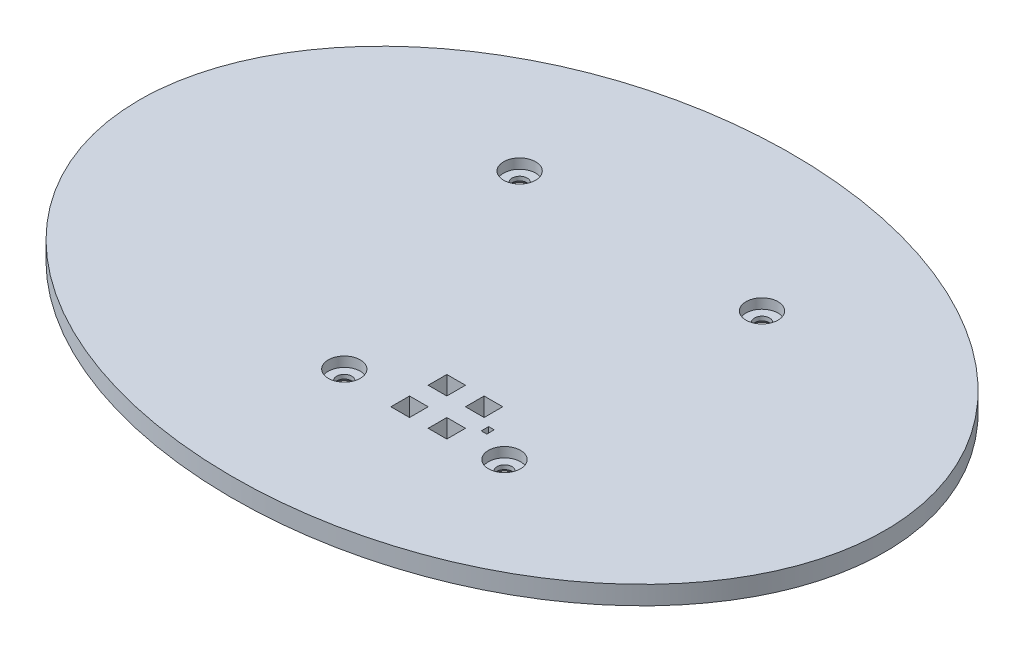
ISO-10303-21;
HEADER;
FILE_DESCRIPTION(('STEP AP214'),'2;1');
FILE_NAME('part.step','',(''),(''),'','','');
FILE_SCHEMA(('AUTOMOTIVE_DESIGN { 1 0 10303 214 1 1 1 1 }'));
ENDSEC;
DATA;
#1=APPLICATION_CONTEXT('core data for automotive mechanical design processes');
#2=APPLICATION_PROTOCOL_DEFINITION('international standard','automotive_design',2000,#1);
#3=PRODUCT_CONTEXT('',#1,'mechanical');
#4=PRODUCT('Part','Part','',(#3));
#5=PRODUCT_RELATED_PRODUCT_CATEGORY('part','',(#4));
#6=PRODUCT_DEFINITION_FORMATION('','',#4);
#7=PRODUCT_DEFINITION_CONTEXT('part definition',#1,'design');
#8=PRODUCT_DEFINITION('design','',#6,#7);
#9=PRODUCT_DEFINITION_SHAPE('','',#8);
#10=(LENGTH_UNIT() NAMED_UNIT(*) SI_UNIT(.MILLI.,.METRE.));
#11=(NAMED_UNIT(*) PLANE_ANGLE_UNIT() SI_UNIT($,.RADIAN.));
#12=(NAMED_UNIT(*) SI_UNIT($,.STERADIAN.) SOLID_ANGLE_UNIT());
#13=UNCERTAINTY_MEASURE_WITH_UNIT(LENGTH_MEASURE(1.E-05),#10,'distance_accuracy_value','');
#14=(GEOMETRIC_REPRESENTATION_CONTEXT(3) GLOBAL_UNCERTAINTY_ASSIGNED_CONTEXT((#13)) GLOBAL_UNIT_ASSIGNED_CONTEXT((#10,
#11,#12)) REPRESENTATION_CONTEXT('',''));
#15=CARTESIAN_POINT('',(0.,0.,0.));
#16=DIRECTION('',(0.,0.,1.));
#17=DIRECTION('',(1.,0.,0.));
#18=AXIS2_PLACEMENT_3D('',#15,#16,#17);
#19=CARTESIAN_POINT('',(0.,2.54,0.));
#20=DIRECTION('',(0.,1.,0.));
#21=DIRECTION('',(-1.,0.,0.));
#22=AXIS2_PLACEMENT_3D('',#19,#20,#21);
#23=ELLIPSE('',#22,50.8,38.1);
#24=DIRECTION('',(0.,-1.,0.));
#25=VECTOR('',#24,1.);
#26=SURFACE_OF_LINEAR_EXTRUSION('',#23,#25);
#27=CARTESIAN_POINT('',(-50.8,2.54,0.));
#28=VERTEX_POINT('',#27);
#29=EDGE_CURVE('E11',#28,#28,#23,.T.);
#30=ORIENTED_EDGE('',*,*,#29,.F.);
#31=EDGE_LOOP('',(#30));
#32=FACE_BOUND('',#31,.T.);
#33=CARTESIAN_POINT('',(0.,0.,0.));
#34=DIRECTION('',(0.,1.,0.));
#35=DIRECTION('',(-1.,0.,0.));
#36=AXIS2_PLACEMENT_3D('',#33,#34,#35);
#37=ELLIPSE('',#36,50.8,38.1);
#38=CARTESIAN_POINT('',(-50.8,0.,0.));
#39=VERTEX_POINT('',#38);
#40=EDGE_CURVE('E39',#39,#39,#37,.T.);
#41=ORIENTED_EDGE('',*,*,#40,.T.);
#42=EDGE_LOOP('',(#41));
#43=FACE_BOUND('',#42,.T.);
#44=ADVANCED_FACE('F35',(#32,#43),#26,.F.);
#45=CARTESIAN_POINT('',(0.,2.54,0.));
#46=DIRECTION('',(0.,1.,0.));
#47=DIRECTION('',(0.,0.,1.));
#48=AXIS2_PLACEMENT_3D('',#45,#46,#47);
#49=PLANE('',#48);
#50=CARTESIAN_POINT('',(-5.08000000000001,2.54,17.78));
#51=DIRECTION('',(0.,1.,0.));
#52=DIRECTION('',(0.,0.,1.));
#53=AXIS2_PLACEMENT_3D('',#50,#51,#52);
#54=CIRCLE('',#53,2.18313);
#55=CARTESIAN_POINT('',(-5.08000000000001,2.54,19.96313));
#56=VERTEX_POINT('',#55);
#57=EDGE_CURVE('E521',#56,#56,#54,.T.);
#58=ORIENTED_EDGE('',*,*,#57,.F.);
#59=EDGE_LOOP('',(#58));
#60=FACE_BOUND('',#59,.T.);
#61=CARTESIAN_POINT('',(16.51,2.54,17.541875));
#62=DIRECTION('',(0.,1.,0.));
#63=DIRECTION('',(0.,0.,1.));
#64=AXIS2_PLACEMENT_3D('',#61,#62,#63);
#65=CIRCLE('',#64,2.18313);
#66=CARTESIAN_POINT('',(16.51,2.54,19.725005));
#67=VERTEX_POINT('',#66);
#68=EDGE_CURVE('E536',#67,#67,#65,.T.);
#69=ORIENTED_EDGE('',*,*,#68,.F.);
#70=EDGE_LOOP('',(#69));
#71=FACE_BOUND('',#70,.T.);
#72=CARTESIAN_POINT('',(16.51,2.54,-17.541875));
#73=DIRECTION('',(0.,1.,0.));
#74=DIRECTION('',(0.,0.,1.));
#75=AXIS2_PLACEMENT_3D('',#72,#73,#74);
#76=CIRCLE('',#75,2.18313);
#77=CARTESIAN_POINT('',(16.51,2.54,-15.358745));
#78=VERTEX_POINT('',#77);
#79=EDGE_CURVE('E551',#78,#78,#76,.T.);
#80=ORIENTED_EDGE('',*,*,#79,.F.);
#81=EDGE_LOOP('',(#80));
#82=FACE_BOUND('',#81,.T.);
#83=CARTESIAN_POINT('',(-16.51,2.54,-17.541875));
#84=DIRECTION('',(0.,1.,0.));
#85=DIRECTION('',(0.,0.,1.));
#86=AXIS2_PLACEMENT_3D('',#83,#84,#85);
#87=CIRCLE('',#86,2.18313);
#88=CARTESIAN_POINT('',(-16.51,2.54,-15.358745));
#89=VERTEX_POINT('',#88);
#90=EDGE_CURVE('E566',#89,#89,#87,.T.);
#91=ORIENTED_EDGE('',*,*,#90,.F.);
#92=EDGE_LOOP('',(#91));
#93=FACE_BOUND('',#92,.T.);
#94=DIRECTION('',(0.,0.,1.));
#95=VECTOR('',#94,1.);
#96=CARTESIAN_POINT('',(11.5379302112366,2.54,14.732));
#97=LINE('',#96,#95);
#98=CARTESIAN_POINT('',(11.5379302112366,2.54,14.732));
#99=VERTEX_POINT('',#98);
#100=CARTESIAN_POINT('',(11.5379302112366,2.54,15.748));
#101=VERTEX_POINT('',#100);
#102=EDGE_CURVE('E49',#99,#101,#97,.T.);
#103=ORIENTED_EDGE('',*,*,#102,.F.);
#104=DIRECTION('',(-1.,0.,0.));
#105=VECTOR('',#104,1.);
#106=CARTESIAN_POINT('',(11.5379302112366,2.54,14.732));
#107=LINE('',#106,#105);
#108=CARTESIAN_POINT('',(12.2999302112366,2.54,14.732));
#109=VERTEX_POINT('',#108);
#110=EDGE_CURVE('E189',#109,#99,#107,.T.);
#111=ORIENTED_EDGE('',*,*,#110,.F.);
#112=DIRECTION('',(0.,0.,-1.));
#113=VECTOR('',#112,1.);
#114=CARTESIAN_POINT('',(12.2999302112366,2.54,14.732));
#115=LINE('',#114,#113);
#116=CARTESIAN_POINT('',(12.2999302112366,2.54,15.748));
#117=VERTEX_POINT('',#116);
#118=EDGE_CURVE('E192',#117,#109,#115,.T.);
#119=ORIENTED_EDGE('',*,*,#118,.F.);
#120=DIRECTION('',(1.,0.,0.));
#121=VECTOR('',#120,1.);
#122=CARTESIAN_POINT('',(11.5379302112366,2.54,15.748));
#123=LINE('',#122,#121);
#124=EDGE_CURVE('E201',#101,#117,#123,.T.);
#125=ORIENTED_EDGE('',*,*,#124,.F.);
#126=EDGE_LOOP('',(#103,#111,#119,#125));
#127=FACE_BOUND('',#126,.T.);
#128=DIRECTION('',(0.,0.,-1.));
#129=VECTOR('',#128,1.);
#130=CARTESIAN_POINT('',(5.08,2.54,13.97));
#131=LINE('',#130,#129);
#132=CARTESIAN_POINT('',(5.08,2.54,13.97));
#133=VERTEX_POINT('',#132);
#134=CARTESIAN_POINT('',(5.08,2.54,11.43));
#135=VERTEX_POINT('',#134);
#136=EDGE_CURVE('E207',#133,#135,#131,.T.);
#137=ORIENTED_EDGE('',*,*,#136,.F.);
#138=DIRECTION('',(1.,0.,0.));
#139=VECTOR('',#138,1.);
#140=CARTESIAN_POINT('',(5.08,2.54,13.97));
#141=LINE('',#140,#139);
#142=CARTESIAN_POINT('',(2.54,2.54,13.97));
#143=VERTEX_POINT('',#142);
#144=EDGE_CURVE('E215',#143,#133,#141,.T.);
#145=ORIENTED_EDGE('',*,*,#144,.F.);
#146=DIRECTION('',(0.,0.,1.));
#147=VECTOR('',#146,1.);
#148=CARTESIAN_POINT('',(2.54,2.54,13.97));
#149=LINE('',#148,#147);
#150=CARTESIAN_POINT('',(2.54,2.54,11.43));
#151=VERTEX_POINT('',#150);
#152=EDGE_CURVE('E229',#151,#143,#149,.T.);
#153=ORIENTED_EDGE('',*,*,#152,.F.);
#154=DIRECTION('',(-1.,0.,0.));
#155=VECTOR('',#154,1.);
#156=CARTESIAN_POINT('',(5.08,2.54,11.43));
#157=LINE('',#156,#155);
#158=EDGE_CURVE('E226',#135,#151,#157,.T.);
#159=ORIENTED_EDGE('',*,*,#158,.F.);
#160=EDGE_LOOP('',(#137,#145,#153,#159));
#161=FACE_BOUND('',#160,.T.);
#162=DIRECTION('',(0.,0.,-1.));
#163=VECTOR('',#162,1.);
#164=CARTESIAN_POINT('',(5.08,2.54,16.51));
#165=LINE('',#164,#163);
#166=CARTESIAN_POINT('',(5.08,2.54,19.05));
#167=VERTEX_POINT('',#166);
#168=CARTESIAN_POINT('',(5.08,2.54,16.51));
#169=VERTEX_POINT('',#168);
#170=EDGE_CURVE('E236',#167,#169,#165,.T.);
#171=ORIENTED_EDGE('',*,*,#170,.F.);
#172=DIRECTION('',(1.,0.,0.));
#173=VECTOR('',#172,1.);
#174=CARTESIAN_POINT('',(5.08,2.54,19.05));
#175=LINE('',#174,#173);
#176=CARTESIAN_POINT('',(2.54,2.54,19.05));
#177=VERTEX_POINT('',#176);
#178=EDGE_CURVE('E247',#177,#167,#175,.T.);
#179=ORIENTED_EDGE('',*,*,#178,.F.);
#180=DIRECTION('',(0.,0.,1.));
#181=VECTOR('',#180,1.);
#182=CARTESIAN_POINT('',(2.54,2.54,16.51));
#183=LINE('',#182,#181);
#184=CARTESIAN_POINT('',(2.54,2.54,16.51));
#185=VERTEX_POINT('',#184);
#186=EDGE_CURVE('E261',#185,#177,#183,.T.);
#187=ORIENTED_EDGE('',*,*,#186,.F.);
#188=DIRECTION('',(-1.,0.,0.));
#189=VECTOR('',#188,1.);
#190=CARTESIAN_POINT('',(5.08,2.54,16.51));
#191=LINE('',#190,#189);
#192=EDGE_CURVE('E258',#169,#185,#191,.T.);
#193=ORIENTED_EDGE('',*,*,#192,.F.);
#194=EDGE_LOOP('',(#171,#179,#187,#193));
#195=FACE_BOUND('',#194,.T.);
#196=DIRECTION('',(0.,0.,-1.));
#197=VECTOR('',#196,1.);
#198=CARTESIAN_POINT('',(10.16,2.54,13.97));
#199=LINE('',#198,#197);
#200=CARTESIAN_POINT('',(10.16,2.54,13.97));
#201=VERTEX_POINT('',#200);
#202=CARTESIAN_POINT('',(10.16,2.54,11.43));
#203=VERTEX_POINT('',#202);
#204=EDGE_CURVE('E268',#201,#203,#199,.T.);
#205=ORIENTED_EDGE('',*,*,#204,.F.);
#206=DIRECTION('',(1.,0.,0.));
#207=VECTOR('',#206,1.);
#208=CARTESIAN_POINT('',(10.16,2.54,13.97));
#209=LINE('',#208,#207);
#210=CARTESIAN_POINT('',(7.62,2.54,13.97));
#211=VERTEX_POINT('',#210);
#212=EDGE_CURVE('E279',#211,#201,#209,.T.);
#213=ORIENTED_EDGE('',*,*,#212,.F.);
#214=DIRECTION('',(0.,0.,1.));
#215=VECTOR('',#214,1.);
#216=CARTESIAN_POINT('',(7.62,2.54,13.97));
#217=LINE('',#216,#215);
#218=CARTESIAN_POINT('',(7.62,2.54,11.43));
#219=VERTEX_POINT('',#218);
#220=EDGE_CURVE('E293',#219,#211,#217,.T.);
#221=ORIENTED_EDGE('',*,*,#220,.F.);
#222=DIRECTION('',(-1.,0.,0.));
#223=VECTOR('',#222,1.);
#224=CARTESIAN_POINT('',(10.16,2.54,11.43));
#225=LINE('',#224,#223);
#226=EDGE_CURVE('E290',#203,#219,#225,.T.);
#227=ORIENTED_EDGE('',*,*,#226,.F.);
#228=EDGE_LOOP('',(#205,#213,#221,#227));
#229=FACE_BOUND('',#228,.T.);
#230=DIRECTION('',(0.,0.,-1.));
#231=VECTOR('',#230,1.);
#232=CARTESIAN_POINT('',(10.16,2.54,19.05));
#233=LINE('',#232,#231);
#234=CARTESIAN_POINT('',(10.16,2.54,19.05));
#235=VERTEX_POINT('',#234);
#236=CARTESIAN_POINT('',(10.16,2.54,16.51));
#237=VERTEX_POINT('',#236);
#238=EDGE_CURVE('E300',#235,#237,#233,.T.);
#239=ORIENTED_EDGE('',*,*,#238,.F.);
#240=DIRECTION('',(1.,0.,0.));
#241=VECTOR('',#240,1.);
#242=CARTESIAN_POINT('',(10.16,2.54,19.05));
#243=LINE('',#242,#241);
#244=CARTESIAN_POINT('',(7.62,2.54,19.05));
#245=VERTEX_POINT('',#244);
#246=EDGE_CURVE('E311',#245,#235,#243,.T.);
#247=ORIENTED_EDGE('',*,*,#246,.F.);
#248=DIRECTION('',(0.,0.,1.));
#249=VECTOR('',#248,1.);
#250=CARTESIAN_POINT('',(7.62,2.54,19.05));
#251=LINE('',#250,#249);
#252=CARTESIAN_POINT('',(7.62,2.54,16.51));
#253=VERTEX_POINT('',#252);
#254=EDGE_CURVE('E325',#253,#245,#251,.T.);
#255=ORIENTED_EDGE('',*,*,#254,.F.);
#256=DIRECTION('',(-1.,0.,0.));
#257=VECTOR('',#256,1.);
#258=CARTESIAN_POINT('',(10.16,2.54,16.51));
#259=LINE('',#258,#257);
#260=EDGE_CURVE('E322',#237,#253,#259,.T.);
#261=ORIENTED_EDGE('',*,*,#260,.F.);
#262=EDGE_LOOP('',(#239,#247,#255,#261));
#263=FACE_BOUND('',#262,.T.);
#264=ORIENTED_EDGE('',*,*,#29,.T.);
#265=EDGE_LOOP('',(#264));
#266=FACE_BOUND('',#265,.T.);
#267=ADVANCED_FACE('F348',(#60,#71,#82,#93,#127,#161,#195,#229,#263,#266),#49,.T.);
#268=CARTESIAN_POINT('',(0.,0.,0.));
#269=DIRECTION('',(0.,1.,0.));
#270=DIRECTION('',(0.,0.,1.));
#271=AXIS2_PLACEMENT_3D('',#268,#269,#270);
#272=PLANE('',#271);
#273=CARTESIAN_POINT('',(-5.08000000000001,0.,17.78));
#274=DIRECTION('',(0.,1.,0.));
#275=DIRECTION('',(0.,0.,1.));
#276=AXIS2_PLACEMENT_3D('',#273,#274,#275);
#277=CIRCLE('',#276,1.6637);
#278=CARTESIAN_POINT('',(-5.08000000000001,0.,19.4437));
#279=VERTEX_POINT('',#278);
#280=EDGE_CURVE('E522',#279,#279,#277,.T.);
#281=ORIENTED_EDGE('',*,*,#280,.T.);
#282=EDGE_LOOP('',(#281));
#283=FACE_BOUND('',#282,.T.);
#284=CARTESIAN_POINT('',(16.51,0.,17.541875));
#285=DIRECTION('',(0.,1.,0.));
#286=DIRECTION('',(0.,0.,1.));
#287=AXIS2_PLACEMENT_3D('',#284,#285,#286);
#288=CIRCLE('',#287,1.6637);
#289=CARTESIAN_POINT('',(16.51,0.,19.205575));
#290=VERTEX_POINT('',#289);
#291=EDGE_CURVE('E533',#290,#290,#288,.T.);
#292=ORIENTED_EDGE('',*,*,#291,.T.);
#293=EDGE_LOOP('',(#292));
#294=FACE_BOUND('',#293,.T.);
#295=CARTESIAN_POINT('',(16.51,0.,-17.541875));
#296=DIRECTION('',(0.,1.,0.));
#297=DIRECTION('',(0.,0.,1.));
#298=AXIS2_PLACEMENT_3D('',#295,#296,#297);
#299=CIRCLE('',#298,1.6637);
#300=CARTESIAN_POINT('',(16.51,0.,-15.878175));
#301=VERTEX_POINT('',#300);
#302=EDGE_CURVE('E548',#301,#301,#299,.T.);
#303=ORIENTED_EDGE('',*,*,#302,.T.);
#304=EDGE_LOOP('',(#303));
#305=FACE_BOUND('',#304,.T.);
#306=CARTESIAN_POINT('',(-16.51,0.,-17.541875));
#307=DIRECTION('',(0.,1.,0.));
#308=DIRECTION('',(0.,0.,1.));
#309=AXIS2_PLACEMENT_3D('',#306,#307,#308);
#310=CIRCLE('',#309,1.6637);
#311=CARTESIAN_POINT('',(-16.51,0.,-15.878175));
#312=VERTEX_POINT('',#311);
#313=EDGE_CURVE('E563',#312,#312,#310,.T.);
#314=ORIENTED_EDGE('',*,*,#313,.T.);
#315=EDGE_LOOP('',(#314));
#316=FACE_BOUND('',#315,.T.);
#317=DIRECTION('',(-1.,0.,0.));
#318=VECTOR('',#317,1.);
#319=CARTESIAN_POINT('',(11.5379302112366,0.,14.732));
#320=LINE('',#319,#318);
#321=CARTESIAN_POINT('',(12.2999302112366,0.,14.732));
#322=VERTEX_POINT('',#321);
#323=CARTESIAN_POINT('',(11.5379302112366,0.,14.732));
#324=VERTEX_POINT('',#323);
#325=EDGE_CURVE('E179',#322,#324,#320,.T.);
#326=ORIENTED_EDGE('',*,*,#325,.T.);
#327=DIRECTION('',(0.,0.,1.));
#328=VECTOR('',#327,1.);
#329=CARTESIAN_POINT('',(11.5379302112366,0.,14.732));
#330=LINE('',#329,#328);
#331=CARTESIAN_POINT('',(11.5379302112366,0.,15.748));
#332=VERTEX_POINT('',#331);
#333=EDGE_CURVE('E173',#324,#332,#330,.T.);
#334=ORIENTED_EDGE('',*,*,#333,.T.);
#335=DIRECTION('',(1.,0.,0.));
#336=VECTOR('',#335,1.);
#337=CARTESIAN_POINT('',(11.5379302112366,0.,15.748));
#338=LINE('',#337,#336);
#339=CARTESIAN_POINT('',(12.2999302112366,0.,15.748));
#340=VERTEX_POINT('',#339);
#341=EDGE_CURVE('E182',#332,#340,#338,.T.);
#342=ORIENTED_EDGE('',*,*,#341,.T.);
#343=DIRECTION('',(0.,0.,-1.));
#344=VECTOR('',#343,1.);
#345=CARTESIAN_POINT('',(12.2999302112366,0.,14.732));
#346=LINE('',#345,#344);
#347=EDGE_CURVE('E57',#340,#322,#346,.T.);
#348=ORIENTED_EDGE('',*,*,#347,.T.);
#349=EDGE_LOOP('',(#326,#334,#342,#348));
#350=FACE_BOUND('',#349,.T.);
#351=DIRECTION('',(1.,0.,0.));
#352=VECTOR('',#351,1.);
#353=CARTESIAN_POINT('',(5.08,0.,13.97));
#354=LINE('',#353,#352);
#355=CARTESIAN_POINT('',(2.54,0.,13.97));
#356=VERTEX_POINT('',#355);
#357=CARTESIAN_POINT('',(5.08,0.,13.97));
#358=VERTEX_POINT('',#357);
#359=EDGE_CURVE('E221',#356,#358,#354,.T.);
#360=ORIENTED_EDGE('',*,*,#359,.T.);
#361=DIRECTION('',(0.,0.,-1.));
#362=VECTOR('',#361,1.);
#363=CARTESIAN_POINT('',(5.08,0.,13.97));
#364=LINE('',#363,#362);
#365=CARTESIAN_POINT('',(5.08,0.,11.43));
#366=VERTEX_POINT('',#365);
#367=EDGE_CURVE('E211',#358,#366,#364,.T.);
#368=ORIENTED_EDGE('',*,*,#367,.T.);
#369=DIRECTION('',(-1.,0.,0.));
#370=VECTOR('',#369,1.);
#371=CARTESIAN_POINT('',(5.08,0.,11.43));
#372=LINE('',#371,#370);
#373=CARTESIAN_POINT('',(2.54,0.,11.43));
#374=VERTEX_POINT('',#373);
#375=EDGE_CURVE('E214',#366,#374,#372,.T.);
#376=ORIENTED_EDGE('',*,*,#375,.T.);
#377=DIRECTION('',(0.,0.,1.));
#378=VECTOR('',#377,1.);
#379=CARTESIAN_POINT('',(2.54,0.,13.97));
#380=LINE('',#379,#378);
#381=EDGE_CURVE('E218',#374,#356,#380,.T.);
#382=ORIENTED_EDGE('',*,*,#381,.T.);
#383=EDGE_LOOP('',(#360,#368,#376,#382));
#384=FACE_BOUND('',#383,.T.);
#385=DIRECTION('',(1.,0.,0.));
#386=VECTOR('',#385,1.);
#387=CARTESIAN_POINT('',(5.08,0.,19.05));
#388=LINE('',#387,#386);
#389=CARTESIAN_POINT('',(2.54,0.,19.05));
#390=VERTEX_POINT('',#389);
#391=CARTESIAN_POINT('',(5.08,0.,19.05));
#392=VERTEX_POINT('',#391);
#393=EDGE_CURVE('E253',#390,#392,#388,.T.);
#394=ORIENTED_EDGE('',*,*,#393,.T.);
#395=DIRECTION('',(0.,0.,-1.));
#396=VECTOR('',#395,1.);
#397=CARTESIAN_POINT('',(5.08,0.,16.51));
#398=LINE('',#397,#396);
#399=CARTESIAN_POINT('',(5.08,0.,16.51));
#400=VERTEX_POINT('',#399);
#401=EDGE_CURVE('E243',#392,#400,#398,.T.);
#402=ORIENTED_EDGE('',*,*,#401,.T.);
#403=DIRECTION('',(-1.,0.,0.));
#404=VECTOR('',#403,1.);
#405=CARTESIAN_POINT('',(5.08,0.,16.51));
#406=LINE('',#405,#404);
#407=CARTESIAN_POINT('',(2.54,0.,16.51));
#408=VERTEX_POINT('',#407);
#409=EDGE_CURVE('E246',#400,#408,#406,.T.);
#410=ORIENTED_EDGE('',*,*,#409,.T.);
#411=DIRECTION('',(0.,0.,1.));
#412=VECTOR('',#411,1.);
#413=CARTESIAN_POINT('',(2.54,0.,16.51));
#414=LINE('',#413,#412);
#415=EDGE_CURVE('E250',#408,#390,#414,.T.);
#416=ORIENTED_EDGE('',*,*,#415,.T.);
#417=EDGE_LOOP('',(#394,#402,#410,#416));
#418=FACE_BOUND('',#417,.T.);
#419=DIRECTION('',(1.,0.,0.));
#420=VECTOR('',#419,1.);
#421=CARTESIAN_POINT('',(10.16,0.,13.97));
#422=LINE('',#421,#420);
#423=CARTESIAN_POINT('',(7.62,0.,13.97));
#424=VERTEX_POINT('',#423);
#425=CARTESIAN_POINT('',(10.16,0.,13.97));
#426=VERTEX_POINT('',#425);
#427=EDGE_CURVE('E285',#424,#426,#422,.T.);
#428=ORIENTED_EDGE('',*,*,#427,.T.);
#429=DIRECTION('',(0.,0.,-1.));
#430=VECTOR('',#429,1.);
#431=CARTESIAN_POINT('',(10.16,0.,13.97));
#432=LINE('',#431,#430);
#433=CARTESIAN_POINT('',(10.16,0.,11.43));
#434=VERTEX_POINT('',#433);
#435=EDGE_CURVE('E275',#426,#434,#432,.T.);
#436=ORIENTED_EDGE('',*,*,#435,.T.);
#437=DIRECTION('',(-1.,0.,0.));
#438=VECTOR('',#437,1.);
#439=CARTESIAN_POINT('',(10.16,0.,11.43));
#440=LINE('',#439,#438);
#441=CARTESIAN_POINT('',(7.62,0.,11.43));
#442=VERTEX_POINT('',#441);
#443=EDGE_CURVE('E278',#434,#442,#440,.T.);
#444=ORIENTED_EDGE('',*,*,#443,.T.);
#445=DIRECTION('',(0.,0.,1.));
#446=VECTOR('',#445,1.);
#447=CARTESIAN_POINT('',(7.62,0.,13.97));
#448=LINE('',#447,#446);
#449=EDGE_CURVE('E282',#442,#424,#448,.T.);
#450=ORIENTED_EDGE('',*,*,#449,.T.);
#451=EDGE_LOOP('',(#428,#436,#444,#450));
#452=FACE_BOUND('',#451,.T.);
#453=DIRECTION('',(1.,0.,0.));
#454=VECTOR('',#453,1.);
#455=CARTESIAN_POINT('',(10.16,0.,19.05));
#456=LINE('',#455,#454);
#457=CARTESIAN_POINT('',(7.62,0.,19.05));
#458=VERTEX_POINT('',#457);
#459=CARTESIAN_POINT('',(10.16,0.,19.05));
#460=VERTEX_POINT('',#459);
#461=EDGE_CURVE('E317',#458,#460,#456,.T.);
#462=ORIENTED_EDGE('',*,*,#461,.T.);
#463=DIRECTION('',(0.,0.,-1.));
#464=VECTOR('',#463,1.);
#465=CARTESIAN_POINT('',(10.16,0.,19.05));
#466=LINE('',#465,#464);
#467=CARTESIAN_POINT('',(10.16,0.,16.51));
#468=VERTEX_POINT('',#467);
#469=EDGE_CURVE('E307',#460,#468,#466,.T.);
#470=ORIENTED_EDGE('',*,*,#469,.T.);
#471=DIRECTION('',(-1.,0.,0.));
#472=VECTOR('',#471,1.);
#473=CARTESIAN_POINT('',(10.16,0.,16.51));
#474=LINE('',#473,#472);
#475=CARTESIAN_POINT('',(7.62,0.,16.51));
#476=VERTEX_POINT('',#475);
#477=EDGE_CURVE('E310',#468,#476,#474,.T.);
#478=ORIENTED_EDGE('',*,*,#477,.T.);
#479=DIRECTION('',(0.,0.,1.));
#480=VECTOR('',#479,1.);
#481=CARTESIAN_POINT('',(7.62,0.,19.05));
#482=LINE('',#481,#480);
#483=EDGE_CURVE('E314',#476,#458,#482,.T.);
#484=ORIENTED_EDGE('',*,*,#483,.T.);
#485=EDGE_LOOP('',(#462,#470,#478,#484));
#486=FACE_BOUND('',#485,.T.);
#487=ORIENTED_EDGE('',*,*,#40,.F.);
#488=EDGE_LOOP('',(#487));
#489=FACE_BOUND('',#488,.T.);
#490=ADVANCED_FACE('F186',(#283,#294,#305,#316,#350,#384,#418,#452,#486,#489),#272,.F.);
#491=CARTESIAN_POINT('',(10.16,0.,19.05));
#492=DIRECTION('',(1.,0.,0.));
#493=DIRECTION('',(0.,0.,-1.));
#494=AXIS2_PLACEMENT_3D('',#491,#492,#493);
#495=PLANE('',#494);
#496=ORIENTED_EDGE('',*,*,#238,.T.);
#497=DIRECTION('',(0.,1.,0.));
#498=VECTOR('',#497,1.);
#499=CARTESIAN_POINT('',(10.16,0.,16.51));
#500=LINE('',#499,#498);
#501=EDGE_CURVE('E320',#468,#237,#500,.T.);
#502=ORIENTED_EDGE('',*,*,#501,.F.);
#503=ORIENTED_EDGE('',*,*,#469,.F.);
#504=DIRECTION('',(0.,1.,0.));
#505=VECTOR('',#504,1.);
#506=CARTESIAN_POINT('',(10.16,0.,19.05));
#507=LINE('',#506,#505);
#508=EDGE_CURVE('E330',#460,#235,#507,.T.);
#509=ORIENTED_EDGE('',*,*,#508,.T.);
#510=EDGE_LOOP('',(#496,#502,#503,#509));
#511=FACE_BOUND('',#510,.T.);
#512=ADVANCED_FACE('F356',(#511),#495,.F.);
#513=CARTESIAN_POINT('',(10.16,0.,19.05));
#514=DIRECTION('',(0.,0.,1.));
#515=DIRECTION('',(1.,0.,0.));
#516=AXIS2_PLACEMENT_3D('',#513,#514,#515);
#517=PLANE('',#516);
#518=ORIENTED_EDGE('',*,*,#246,.T.);
#519=ORIENTED_EDGE('',*,*,#508,.F.);
#520=ORIENTED_EDGE('',*,*,#461,.F.);
#521=DIRECTION('',(0.,1.,0.));
#522=VECTOR('',#521,1.);
#523=CARTESIAN_POINT('',(7.62,0.,19.05));
#524=LINE('',#523,#522);
#525=EDGE_CURVE('E332',#458,#245,#524,.T.);
#526=ORIENTED_EDGE('',*,*,#525,.T.);
#527=EDGE_LOOP('',(#518,#519,#520,#526));
#528=FACE_BOUND('',#527,.T.);
#529=ADVANCED_FACE('F358',(#528),#517,.F.);
#530=CARTESIAN_POINT('',(7.62,0.,19.05));
#531=DIRECTION('',(-1.,0.,0.));
#532=DIRECTION('',(0.,0.,1.));
#533=AXIS2_PLACEMENT_3D('',#530,#531,#532);
#534=PLANE('',#533);
#535=ORIENTED_EDGE('',*,*,#254,.T.);
#536=ORIENTED_EDGE('',*,*,#525,.F.);
#537=ORIENTED_EDGE('',*,*,#483,.F.);
#538=DIRECTION('',(0.,1.,0.));
#539=VECTOR('',#538,1.);
#540=CARTESIAN_POINT('',(7.62,0.,16.51));
#541=LINE('',#540,#539);
#542=EDGE_CURVE('E334',#476,#253,#541,.T.);
#543=ORIENTED_EDGE('',*,*,#542,.T.);
#544=EDGE_LOOP('',(#535,#536,#537,#543));
#545=FACE_BOUND('',#544,.T.);
#546=ADVANCED_FACE('F352',(#545),#534,.F.);
#547=CARTESIAN_POINT('',(10.16,0.,16.51));
#548=DIRECTION('',(0.,0.,-1.));
#549=DIRECTION('',(-1.,0.,0.));
#550=AXIS2_PLACEMENT_3D('',#547,#548,#549);
#551=PLANE('',#550);
#552=ORIENTED_EDGE('',*,*,#260,.T.);
#553=ORIENTED_EDGE('',*,*,#542,.F.);
#554=ORIENTED_EDGE('',*,*,#477,.F.);
#555=ORIENTED_EDGE('',*,*,#501,.T.);
#556=EDGE_LOOP('',(#552,#553,#554,#555));
#557=FACE_BOUND('',#556,.T.);
#558=ADVANCED_FACE('F341',(#557),#551,.F.);
#559=CARTESIAN_POINT('',(10.16,0.,13.97));
#560=DIRECTION('',(1.,0.,0.));
#561=DIRECTION('',(0.,0.,-1.));
#562=AXIS2_PLACEMENT_3D('',#559,#560,#561);
#563=PLANE('',#562);
#564=ORIENTED_EDGE('',*,*,#204,.T.);
#565=DIRECTION('',(0.,1.,0.));
#566=VECTOR('',#565,1.);
#567=CARTESIAN_POINT('',(10.16,0.,11.43));
#568=LINE('',#567,#566);
#569=EDGE_CURVE('E288',#434,#203,#568,.T.);
#570=ORIENTED_EDGE('',*,*,#569,.F.);
#571=ORIENTED_EDGE('',*,*,#435,.F.);
#572=DIRECTION('',(0.,1.,0.));
#573=VECTOR('',#572,1.);
#574=CARTESIAN_POINT('',(10.16,0.,13.97));
#575=LINE('',#574,#573);
#576=EDGE_CURVE('E298',#426,#201,#575,.T.);
#577=ORIENTED_EDGE('',*,*,#576,.T.);
#578=EDGE_LOOP('',(#564,#570,#571,#577));
#579=FACE_BOUND('',#578,.T.);
#580=ADVANCED_FACE('F387',(#579),#563,.F.);
#581=CARTESIAN_POINT('',(10.16,0.,13.97));
#582=DIRECTION('',(0.,0.,1.));
#583=DIRECTION('',(1.,0.,0.));
#584=AXIS2_PLACEMENT_3D('',#581,#582,#583);
#585=PLANE('',#584);
#586=ORIENTED_EDGE('',*,*,#212,.T.);
#587=ORIENTED_EDGE('',*,*,#576,.F.);
#588=ORIENTED_EDGE('',*,*,#427,.F.);
#589=DIRECTION('',(0.,1.,0.));
#590=VECTOR('',#589,1.);
#591=CARTESIAN_POINT('',(7.62,0.,13.97));
#592=LINE('',#591,#590);
#593=EDGE_CURVE('E301',#424,#211,#592,.T.);
#594=ORIENTED_EDGE('',*,*,#593,.T.);
#595=EDGE_LOOP('',(#586,#587,#588,#594));
#596=FACE_BOUND('',#595,.T.);
#597=ADVANCED_FACE('F391',(#596),#585,.F.);
#598=CARTESIAN_POINT('',(7.62,0.,13.97));
#599=DIRECTION('',(-1.,0.,0.));
#600=DIRECTION('',(0.,0.,1.));
#601=AXIS2_PLACEMENT_3D('',#598,#599,#600);
#602=PLANE('',#601);
#603=ORIENTED_EDGE('',*,*,#220,.T.);
#604=ORIENTED_EDGE('',*,*,#593,.F.);
#605=ORIENTED_EDGE('',*,*,#449,.F.);
#606=DIRECTION('',(0.,1.,0.));
#607=VECTOR('',#606,1.);
#608=CARTESIAN_POINT('',(7.62,0.,11.43));
#609=LINE('',#608,#607);
#610=EDGE_CURVE('E303',#442,#219,#609,.T.);
#611=ORIENTED_EDGE('',*,*,#610,.T.);
#612=EDGE_LOOP('',(#603,#604,#605,#611));
#613=FACE_BOUND('',#612,.T.);
#614=ADVANCED_FACE('F396',(#613),#602,.F.);
#615=CARTESIAN_POINT('',(10.16,0.,11.43));
#616=DIRECTION('',(0.,0.,-1.));
#617=DIRECTION('',(-1.,0.,0.));
#618=AXIS2_PLACEMENT_3D('',#615,#616,#617);
#619=PLANE('',#618);
#620=ORIENTED_EDGE('',*,*,#226,.T.);
#621=ORIENTED_EDGE('',*,*,#610,.F.);
#622=ORIENTED_EDGE('',*,*,#443,.F.);
#623=ORIENTED_EDGE('',*,*,#569,.T.);
#624=EDGE_LOOP('',(#620,#621,#622,#623));
#625=FACE_BOUND('',#624,.T.);
#626=ADVANCED_FACE('F400',(#625),#619,.F.);
#627=CARTESIAN_POINT('',(5.08,0.,16.51));
#628=DIRECTION('',(1.,0.,0.));
#629=DIRECTION('',(0.,0.,-1.));
#630=AXIS2_PLACEMENT_3D('',#627,#628,#629);
#631=PLANE('',#630);
#632=ORIENTED_EDGE('',*,*,#170,.T.);
#633=DIRECTION('',(0.,1.,0.));
#634=VECTOR('',#633,1.);
#635=CARTESIAN_POINT('',(5.08,0.,16.51));
#636=LINE('',#635,#634);
#637=EDGE_CURVE('E256',#400,#169,#636,.T.);
#638=ORIENTED_EDGE('',*,*,#637,.F.);
#639=ORIENTED_EDGE('',*,*,#401,.F.);
#640=DIRECTION('',(0.,1.,0.));
#641=VECTOR('',#640,1.);
#642=CARTESIAN_POINT('',(5.08,0.,19.05));
#643=LINE('',#642,#641);
#644=EDGE_CURVE('E266',#392,#167,#643,.T.);
#645=ORIENTED_EDGE('',*,*,#644,.T.);
#646=EDGE_LOOP('',(#632,#638,#639,#645));
#647=FACE_BOUND('',#646,.T.);
#648=ADVANCED_FACE('F403',(#647),#631,.F.);
#649=CARTESIAN_POINT('',(5.08,0.,19.05));
#650=DIRECTION('',(0.,0.,1.));
#651=DIRECTION('',(1.,0.,0.));
#652=AXIS2_PLACEMENT_3D('',#649,#650,#651);
#653=PLANE('',#652);
#654=ORIENTED_EDGE('',*,*,#178,.T.);
#655=ORIENTED_EDGE('',*,*,#644,.F.);
#656=ORIENTED_EDGE('',*,*,#393,.F.);
#657=DIRECTION('',(0.,1.,0.));
#658=VECTOR('',#657,1.);
#659=CARTESIAN_POINT('',(2.54,0.,19.05));
#660=LINE('',#659,#658);
#661=EDGE_CURVE('E269',#390,#177,#660,.T.);
#662=ORIENTED_EDGE('',*,*,#661,.T.);
#663=EDGE_LOOP('',(#654,#655,#656,#662));
#664=FACE_BOUND('',#663,.T.);
#665=ADVANCED_FACE('F410',(#664),#653,.F.);
#666=CARTESIAN_POINT('',(2.54,0.,16.51));
#667=DIRECTION('',(-1.,0.,0.));
#668=DIRECTION('',(0.,0.,1.));
#669=AXIS2_PLACEMENT_3D('',#666,#667,#668);
#670=PLANE('',#669);
#671=ORIENTED_EDGE('',*,*,#186,.T.);
#672=ORIENTED_EDGE('',*,*,#661,.F.);
#673=ORIENTED_EDGE('',*,*,#415,.F.);
#674=DIRECTION('',(0.,1.,0.));
#675=VECTOR('',#674,1.);
#676=CARTESIAN_POINT('',(2.54,0.,16.51));
#677=LINE('',#676,#675);
#678=EDGE_CURVE('E271',#408,#185,#677,.T.);
#679=ORIENTED_EDGE('',*,*,#678,.T.);
#680=EDGE_LOOP('',(#671,#672,#673,#679));
#681=FACE_BOUND('',#680,.T.);
#682=ADVANCED_FACE('F416',(#681),#670,.F.);
#683=CARTESIAN_POINT('',(5.08,0.,16.51));
#684=DIRECTION('',(0.,0.,-1.));
#685=DIRECTION('',(-1.,0.,0.));
#686=AXIS2_PLACEMENT_3D('',#683,#684,#685);
#687=PLANE('',#686);
#688=ORIENTED_EDGE('',*,*,#192,.T.);
#689=ORIENTED_EDGE('',*,*,#678,.F.);
#690=ORIENTED_EDGE('',*,*,#409,.F.);
#691=ORIENTED_EDGE('',*,*,#637,.T.);
#692=EDGE_LOOP('',(#688,#689,#690,#691));
#693=FACE_BOUND('',#692,.T.);
#694=ADVANCED_FACE('F412',(#693),#687,.F.);
#695=CARTESIAN_POINT('',(5.08,0.,13.97));
#696=DIRECTION('',(1.,0.,0.));
#697=DIRECTION('',(0.,0.,-1.));
#698=AXIS2_PLACEMENT_3D('',#695,#696,#697);
#699=PLANE('',#698);
#700=ORIENTED_EDGE('',*,*,#136,.T.);
#701=DIRECTION('',(0.,1.,0.));
#702=VECTOR('',#701,1.);
#703=CARTESIAN_POINT('',(5.08,0.,11.43));
#704=LINE('',#703,#702);
#705=EDGE_CURVE('E224',#366,#135,#704,.T.);
#706=ORIENTED_EDGE('',*,*,#705,.F.);
#707=ORIENTED_EDGE('',*,*,#367,.F.);
#708=DIRECTION('',(0.,1.,0.));
#709=VECTOR('',#708,1.);
#710=CARTESIAN_POINT('',(5.08,0.,13.97));
#711=LINE('',#710,#709);
#712=EDGE_CURVE('E234',#358,#133,#711,.T.);
#713=ORIENTED_EDGE('',*,*,#712,.T.);
#714=EDGE_LOOP('',(#700,#706,#707,#713));
#715=FACE_BOUND('',#714,.T.);
#716=ADVANCED_FACE('F415',(#715),#699,.F.);
#717=CARTESIAN_POINT('',(5.08,0.,13.97));
#718=DIRECTION('',(0.,0.,1.));
#719=DIRECTION('',(1.,0.,0.));
#720=AXIS2_PLACEMENT_3D('',#717,#718,#719);
#721=PLANE('',#720);
#722=ORIENTED_EDGE('',*,*,#144,.T.);
#723=ORIENTED_EDGE('',*,*,#712,.F.);
#724=ORIENTED_EDGE('',*,*,#359,.F.);
#725=DIRECTION('',(0.,1.,0.));
#726=VECTOR('',#725,1.);
#727=CARTESIAN_POINT('',(2.54,0.,13.97));
#728=LINE('',#727,#726);
#729=EDGE_CURVE('E237',#356,#143,#728,.T.);
#730=ORIENTED_EDGE('',*,*,#729,.T.);
#731=EDGE_LOOP('',(#722,#723,#724,#730));
#732=FACE_BOUND('',#731,.T.);
#733=ADVANCED_FACE('F426',(#732),#721,.F.);
#734=CARTESIAN_POINT('',(2.54,0.,13.97));
#735=DIRECTION('',(-1.,0.,0.));
#736=DIRECTION('',(0.,0.,1.));
#737=AXIS2_PLACEMENT_3D('',#734,#735,#736);
#738=PLANE('',#737);
#739=ORIENTED_EDGE('',*,*,#152,.T.);
#740=ORIENTED_EDGE('',*,*,#729,.F.);
#741=ORIENTED_EDGE('',*,*,#381,.F.);
#742=DIRECTION('',(0.,1.,0.));
#743=VECTOR('',#742,1.);
#744=CARTESIAN_POINT('',(2.54,0.,11.43));
#745=LINE('',#744,#743);
#746=EDGE_CURVE('E239',#374,#151,#745,.T.);
#747=ORIENTED_EDGE('',*,*,#746,.T.);
#748=EDGE_LOOP('',(#739,#740,#741,#747));
#749=FACE_BOUND('',#748,.T.);
#750=ADVANCED_FACE('F431',(#749),#738,.F.);
#751=CARTESIAN_POINT('',(5.08,0.,11.43));
#752=DIRECTION('',(0.,0.,-1.));
#753=DIRECTION('',(-1.,0.,0.));
#754=AXIS2_PLACEMENT_3D('',#751,#752,#753);
#755=PLANE('',#754);
#756=ORIENTED_EDGE('',*,*,#158,.T.);
#757=ORIENTED_EDGE('',*,*,#746,.F.);
#758=ORIENTED_EDGE('',*,*,#375,.F.);
#759=ORIENTED_EDGE('',*,*,#705,.T.);
#760=EDGE_LOOP('',(#756,#757,#758,#759));
#761=FACE_BOUND('',#760,.T.);
#762=ADVANCED_FACE('F428',(#761),#755,.F.);
#763=CARTESIAN_POINT('',(11.5379302112366,0.,14.732));
#764=DIRECTION('',(-1.,0.,0.));
#765=DIRECTION('',(0.,0.,1.));
#766=AXIS2_PLACEMENT_3D('',#763,#764,#765);
#767=PLANE('',#766);
#768=ORIENTED_EDGE('',*,*,#102,.T.);
#769=DIRECTION('',(0.,1.,0.));
#770=VECTOR('',#769,1.);
#771=CARTESIAN_POINT('',(11.5379302112366,0.,15.748));
#772=LINE('',#771,#770);
#773=EDGE_CURVE('E169',#332,#101,#772,.T.);
#774=ORIENTED_EDGE('',*,*,#773,.F.);
#775=ORIENTED_EDGE('',*,*,#333,.F.);
#776=DIRECTION('',(0.,1.,0.));
#777=VECTOR('',#776,1.);
#778=CARTESIAN_POINT('',(11.5379302112366,0.,14.732));
#779=LINE('',#778,#777);
#780=EDGE_CURVE('E205',#324,#99,#779,.T.);
#781=ORIENTED_EDGE('',*,*,#780,.T.);
#782=EDGE_LOOP('',(#768,#774,#775,#781));
#783=FACE_BOUND('',#782,.T.);
#784=ADVANCED_FACE('F171',(#783),#767,.F.);
#785=CARTESIAN_POINT('',(11.5379302112366,0.,14.732));
#786=DIRECTION('',(0.,0.,-1.));
#787=DIRECTION('',(-1.,0.,0.));
#788=AXIS2_PLACEMENT_3D('',#785,#786,#787);
#789=PLANE('',#788);
#790=ORIENTED_EDGE('',*,*,#110,.T.);
#791=ORIENTED_EDGE('',*,*,#780,.F.);
#792=ORIENTED_EDGE('',*,*,#325,.F.);
#793=DIRECTION('',(0.,1.,0.));
#794=VECTOR('',#793,1.);
#795=CARTESIAN_POINT('',(12.2999302112366,0.,14.732));
#796=LINE('',#795,#794);
#797=EDGE_CURVE('E208',#322,#109,#796,.T.);
#798=ORIENTED_EDGE('',*,*,#797,.T.);
#799=EDGE_LOOP('',(#790,#791,#792,#798));
#800=FACE_BOUND('',#799,.T.);
#801=ADVANCED_FACE('F441',(#800),#789,.F.);
#802=CARTESIAN_POINT('',(12.2999302112366,0.,14.732));
#803=DIRECTION('',(1.,0.,0.));
#804=DIRECTION('',(0.,0.,-1.));
#805=AXIS2_PLACEMENT_3D('',#802,#803,#804);
#806=PLANE('',#805);
#807=ORIENTED_EDGE('',*,*,#118,.T.);
#808=ORIENTED_EDGE('',*,*,#797,.F.);
#809=ORIENTED_EDGE('',*,*,#347,.F.);
#810=DIRECTION('',(0.,1.,0.));
#811=VECTOR('',#810,1.);
#812=CARTESIAN_POINT('',(12.2999302112366,0.,15.748));
#813=LINE('',#812,#811);
#814=EDGE_CURVE('E178',#340,#117,#813,.T.);
#815=ORIENTED_EDGE('',*,*,#814,.T.);
#816=EDGE_LOOP('',(#807,#808,#809,#815));
#817=FACE_BOUND('',#816,.T.);
#818=ADVANCED_FACE('F445',(#817),#806,.F.);
#819=CARTESIAN_POINT('',(11.5379302112366,0.,15.748));
#820=DIRECTION('',(0.,0.,1.));
#821=DIRECTION('',(1.,0.,0.));
#822=AXIS2_PLACEMENT_3D('',#819,#820,#821);
#823=PLANE('',#822);
#824=ORIENTED_EDGE('',*,*,#124,.T.);
#825=ORIENTED_EDGE('',*,*,#814,.F.);
#826=ORIENTED_EDGE('',*,*,#341,.F.);
#827=ORIENTED_EDGE('',*,*,#773,.T.);
#828=EDGE_LOOP('',(#824,#825,#826,#827));
#829=FACE_BOUND('',#828,.T.);
#830=ADVANCED_FACE('F183',(#829),#823,.F.);
#831=CARTESIAN_POINT('',(-16.51,0.634999999999998,-17.541875));
#832=DIRECTION('',(0.,-1.,0.));
#833=DIRECTION('',(0.,0.,-1.));
#834=AXIS2_PLACEMENT_3D('',#831,#832,#833);
#835=CONICAL_SURFACE('',#834,1.0287,0.785398163397448);
#836=ORIENTED_EDGE('',*,*,#313,.F.);
#837=EDGE_LOOP('',(#836));
#838=FACE_BOUND('',#837,.T.);
#839=CARTESIAN_POINT('',(-16.51,0.634999999999998,-17.541875));
#840=DIRECTION('',(0.,1.,0.));
#841=DIRECTION('',(0.,0.,1.));
#842=AXIS2_PLACEMENT_3D('',#839,#840,#841);
#843=CIRCLE('',#842,1.0287);
#844=CARTESIAN_POINT('',(-16.51,0.634999999999998,-16.513175));
#845=VERTEX_POINT('',#844);
#846=EDGE_CURVE('E195',#845,#845,#843,.T.);
#847=ORIENTED_EDGE('',*,*,#846,.T.);
#848=EDGE_LOOP('',(#847));
#849=FACE_BOUND('',#848,.T.);
#850=ADVANCED_FACE('F444',(#838,#849),#835,.F.);
#851=CARTESIAN_POINT('',(-16.51,2.54,-17.541875));
#852=DIRECTION('',(0.,1.,0.));
#853=DIRECTION('',(0.,0.,1.));
#854=AXIS2_PLACEMENT_3D('',#851,#852,#853);
#855=CYLINDRICAL_SURFACE('',#854,1.0287);
#856=ORIENTED_EDGE('',*,*,#846,.F.);
#857=EDGE_LOOP('',(#856));
#858=FACE_BOUND('',#857,.T.);
#859=CARTESIAN_POINT('',(-16.51,1.1938,-17.541875));
#860=DIRECTION('',(0.,1.,0.));
#861=DIRECTION('',(0.,0.,1.));
#862=AXIS2_PLACEMENT_3D('',#859,#860,#861);
#863=CIRCLE('',#862,1.0287);
#864=CARTESIAN_POINT('',(-16.51,1.1938,-16.513175));
#865=VERTEX_POINT('',#864);
#866=EDGE_CURVE('E571',#865,#865,#863,.T.);
#867=ORIENTED_EDGE('',*,*,#866,.T.);
#868=EDGE_LOOP('',(#867));
#869=FACE_BOUND('',#868,.T.);
#870=ADVANCED_FACE('F453',(#858,#869),#855,.F.);
#871=CARTESIAN_POINT('',(-15.4813,1.1938,-17.541875));
#872=DIRECTION('',(0.,-1.,0.));
#873=DIRECTION('',(0.,0.,-1.));
#874=AXIS2_PLACEMENT_3D('',#871,#872,#873);
#875=PLANE('',#874);
#876=ORIENTED_EDGE('',*,*,#866,.F.);
#877=EDGE_LOOP('',(#876));
#878=FACE_BOUND('',#877,.T.);
#879=CARTESIAN_POINT('',(-16.51,1.1938,-17.541875));
#880=DIRECTION('',(0.,1.,0.));
#881=DIRECTION('',(0.,0.,1.));
#882=AXIS2_PLACEMENT_3D('',#879,#880,#881);
#883=CIRCLE('',#882,2.18313);
#884=CARTESIAN_POINT('',(-16.51,1.1938,-15.358745));
#885=VERTEX_POINT('',#884);
#886=EDGE_CURVE('E569',#885,#885,#883,.T.);
#887=ORIENTED_EDGE('',*,*,#886,.T.);
#888=EDGE_LOOP('',(#887));
#889=FACE_BOUND('',#888,.T.);
#890=ADVANCED_FACE('F457',(#878,#889),#875,.F.);
#891=CARTESIAN_POINT('',(-16.51,2.54,-17.541875));
#892=DIRECTION('',(0.,1.,0.));
#893=DIRECTION('',(0.,0.,1.));
#894=AXIS2_PLACEMENT_3D('',#891,#892,#893);
#895=CYLINDRICAL_SURFACE('',#894,2.18313);
#896=ORIENTED_EDGE('',*,*,#886,.F.);
#897=EDGE_LOOP('',(#896));
#898=FACE_BOUND('',#897,.T.);
#899=ORIENTED_EDGE('',*,*,#90,.T.);
#900=EDGE_LOOP('',(#899));
#901=FACE_BOUND('',#900,.T.);
#902=ADVANCED_FACE('F461',(#898,#901),#895,.F.);
#903=CARTESIAN_POINT('',(16.51,0.634999999999998,-17.541875));
#904=DIRECTION('',(0.,-1.,0.));
#905=DIRECTION('',(0.,0.,-1.));
#906=AXIS2_PLACEMENT_3D('',#903,#904,#905);
#907=CONICAL_SURFACE('',#906,1.0287,0.78539816339745);
#908=ORIENTED_EDGE('',*,*,#302,.F.);
#909=EDGE_LOOP('',(#908));
#910=FACE_BOUND('',#909,.T.);
#911=CARTESIAN_POINT('',(16.51,0.634999999999998,-17.541875));
#912=DIRECTION('',(0.,1.,0.));
#913=DIRECTION('',(0.,0.,1.));
#914=AXIS2_PLACEMENT_3D('',#911,#912,#913);
#915=CIRCLE('',#914,1.0287);
#916=CARTESIAN_POINT('',(16.51,0.634999999999998,-16.513175));
#917=VERTEX_POINT('',#916);
#918=EDGE_CURVE('E560',#917,#917,#915,.T.);
#919=ORIENTED_EDGE('',*,*,#918,.T.);
#920=EDGE_LOOP('',(#919));
#921=FACE_BOUND('',#920,.T.);
#922=ADVANCED_FACE('F465',(#910,#921),#907,.F.);
#923=CARTESIAN_POINT('',(16.51,2.54,-17.541875));
#924=DIRECTION('',(0.,1.,0.));
#925=DIRECTION('',(0.,0.,1.));
#926=AXIS2_PLACEMENT_3D('',#923,#924,#925);
#927=CYLINDRICAL_SURFACE('',#926,1.0287);
#928=ORIENTED_EDGE('',*,*,#918,.F.);
#929=EDGE_LOOP('',(#928));
#930=FACE_BOUND('',#929,.T.);
#931=CARTESIAN_POINT('',(16.51,1.1938,-17.541875));
#932=DIRECTION('',(0.,1.,0.));
#933=DIRECTION('',(0.,0.,1.));
#934=AXIS2_PLACEMENT_3D('',#931,#932,#933);
#935=CIRCLE('',#934,1.0287);
#936=CARTESIAN_POINT('',(16.51,1.1938,-16.513175));
#937=VERTEX_POINT('',#936);
#938=EDGE_CURVE('E557',#937,#937,#935,.T.);
#939=ORIENTED_EDGE('',*,*,#938,.T.);
#940=EDGE_LOOP('',(#939));
#941=FACE_BOUND('',#940,.T.);
#942=ADVANCED_FACE('F469',(#930,#941),#927,.F.);
#943=CARTESIAN_POINT('',(17.5387,1.1938,-17.541875));
#944=DIRECTION('',(0.,-1.,0.));
#945=DIRECTION('',(0.,0.,-1.));
#946=AXIS2_PLACEMENT_3D('',#943,#944,#945);
#947=PLANE('',#946);
#948=ORIENTED_EDGE('',*,*,#938,.F.);
#949=EDGE_LOOP('',(#948));
#950=FACE_BOUND('',#949,.T.);
#951=CARTESIAN_POINT('',(16.51,1.1938,-17.541875));
#952=DIRECTION('',(0.,1.,0.));
#953=DIRECTION('',(0.,0.,1.));
#954=AXIS2_PLACEMENT_3D('',#951,#952,#953);
#955=CIRCLE('',#954,2.18313);
#956=CARTESIAN_POINT('',(16.51,1.1938,-15.358745));
#957=VERTEX_POINT('',#956);
#958=EDGE_CURVE('E554',#957,#957,#955,.T.);
#959=ORIENTED_EDGE('',*,*,#958,.T.);
#960=EDGE_LOOP('',(#959));
#961=FACE_BOUND('',#960,.T.);
#962=ADVANCED_FACE('F473',(#950,#961),#947,.F.);
#963=CARTESIAN_POINT('',(16.51,2.54,-17.541875));
#964=DIRECTION('',(0.,1.,0.));
#965=DIRECTION('',(0.,0.,1.));
#966=AXIS2_PLACEMENT_3D('',#963,#964,#965);
#967=CYLINDRICAL_SURFACE('',#966,2.18313);
#968=ORIENTED_EDGE('',*,*,#958,.F.);
#969=EDGE_LOOP('',(#968));
#970=FACE_BOUND('',#969,.T.);
#971=ORIENTED_EDGE('',*,*,#79,.T.);
#972=EDGE_LOOP('',(#971));
#973=FACE_BOUND('',#972,.T.);
#974=ADVANCED_FACE('F477',(#970,#973),#967,.F.);
#975=CARTESIAN_POINT('',(16.51,0.634999999999998,17.541875));
#976=DIRECTION('',(0.,-1.,0.));
#977=DIRECTION('',(0.,0.,-1.));
#978=AXIS2_PLACEMENT_3D('',#975,#976,#977);
#979=CONICAL_SURFACE('',#978,1.0287,0.78539816339745);
#980=ORIENTED_EDGE('',*,*,#291,.F.);
#981=EDGE_LOOP('',(#980));
#982=FACE_BOUND('',#981,.T.);
#983=CARTESIAN_POINT('',(16.51,0.634999999999998,17.541875));
#984=DIRECTION('',(0.,1.,0.));
#985=DIRECTION('',(0.,0.,1.));
#986=AXIS2_PLACEMENT_3D('',#983,#984,#985);
#987=CIRCLE('',#986,1.0287);
#988=CARTESIAN_POINT('',(16.51,0.634999999999998,18.570575));
#989=VERTEX_POINT('',#988);
#990=EDGE_CURVE('E545',#989,#989,#987,.T.);
#991=ORIENTED_EDGE('',*,*,#990,.T.);
#992=EDGE_LOOP('',(#991));
#993=FACE_BOUND('',#992,.T.);
#994=ADVANCED_FACE('F481',(#982,#993),#979,.F.);
#995=CARTESIAN_POINT('',(16.51,2.54,17.541875));
#996=DIRECTION('',(0.,1.,0.));
#997=DIRECTION('',(0.,0.,1.));
#998=AXIS2_PLACEMENT_3D('',#995,#996,#997);
#999=CYLINDRICAL_SURFACE('',#998,1.0287);
#1000=ORIENTED_EDGE('',*,*,#990,.F.);
#1001=EDGE_LOOP('',(#1000));
#1002=FACE_BOUND('',#1001,.T.);
#1003=CARTESIAN_POINT('',(16.51,1.1938,17.541875));
#1004=DIRECTION('',(0.,1.,0.));
#1005=DIRECTION('',(0.,0.,1.));
#1006=AXIS2_PLACEMENT_3D('',#1003,#1004,#1005);
#1007=CIRCLE('',#1006,1.0287);
#1008=CARTESIAN_POINT('',(16.51,1.1938,18.570575));
#1009=VERTEX_POINT('',#1008);
#1010=EDGE_CURVE('E542',#1009,#1009,#1007,.T.);
#1011=ORIENTED_EDGE('',*,*,#1010,.T.);
#1012=EDGE_LOOP('',(#1011));
#1013=FACE_BOUND('',#1012,.T.);
#1014=ADVANCED_FACE('F485',(#1002,#1013),#999,.F.);
#1015=CARTESIAN_POINT('',(17.5387,1.1938,17.541875));
#1016=DIRECTION('',(0.,-1.,0.));
#1017=DIRECTION('',(0.,0.,-1.));
#1018=AXIS2_PLACEMENT_3D('',#1015,#1016,#1017);
#1019=PLANE('',#1018);
#1020=ORIENTED_EDGE('',*,*,#1010,.F.);
#1021=EDGE_LOOP('',(#1020));
#1022=FACE_BOUND('',#1021,.T.);
#1023=CARTESIAN_POINT('',(16.51,1.1938,17.541875));
#1024=DIRECTION('',(0.,1.,0.));
#1025=DIRECTION('',(0.,0.,1.));
#1026=AXIS2_PLACEMENT_3D('',#1023,#1024,#1025);
#1027=CIRCLE('',#1026,2.18313);
#1028=CARTESIAN_POINT('',(16.51,1.1938,19.725005));
#1029=VERTEX_POINT('',#1028);
#1030=EDGE_CURVE('E539',#1029,#1029,#1027,.T.);
#1031=ORIENTED_EDGE('',*,*,#1030,.T.);
#1032=EDGE_LOOP('',(#1031));
#1033=FACE_BOUND('',#1032,.T.);
#1034=ADVANCED_FACE('F489',(#1022,#1033),#1019,.F.);
#1035=CARTESIAN_POINT('',(16.51,2.54,17.541875));
#1036=DIRECTION('',(0.,1.,0.));
#1037=DIRECTION('',(0.,0.,1.));
#1038=AXIS2_PLACEMENT_3D('',#1035,#1036,#1037);
#1039=CYLINDRICAL_SURFACE('',#1038,2.18313);
#1040=ORIENTED_EDGE('',*,*,#1030,.F.);
#1041=EDGE_LOOP('',(#1040));
#1042=FACE_BOUND('',#1041,.T.);
#1043=ORIENTED_EDGE('',*,*,#68,.T.);
#1044=EDGE_LOOP('',(#1043));
#1045=FACE_BOUND('',#1044,.T.);
#1046=ADVANCED_FACE('F493',(#1042,#1045),#1039,.F.);
#1047=CARTESIAN_POINT('',(-5.08000000000001,0.634999999999998,17.78));
#1048=DIRECTION('',(0.,-1.,0.));
#1049=DIRECTION('',(0.,0.,-1.));
#1050=AXIS2_PLACEMENT_3D('',#1047,#1048,#1049);
#1051=CONICAL_SURFACE('',#1050,1.0287,0.785398163397449);
#1052=ORIENTED_EDGE('',*,*,#280,.F.);
#1053=EDGE_LOOP('',(#1052));
#1054=FACE_BOUND('',#1053,.T.);
#1055=CARTESIAN_POINT('',(-5.08000000000001,0.634999999999998,17.78));
#1056=DIRECTION('',(0.,1.,0.));
#1057=DIRECTION('',(0.,0.,1.));
#1058=AXIS2_PLACEMENT_3D('',#1055,#1056,#1057);
#1059=CIRCLE('',#1058,1.0287);
#1060=CARTESIAN_POINT('',(-5.08000000000001,0.634999999999998,18.8087));
#1061=VERTEX_POINT('',#1060);
#1062=EDGE_CURVE('E530',#1061,#1061,#1059,.T.);
#1063=ORIENTED_EDGE('',*,*,#1062,.T.);
#1064=EDGE_LOOP('',(#1063));
#1065=FACE_BOUND('',#1064,.T.);
#1066=ADVANCED_FACE('F497',(#1054,#1065),#1051,.F.);
#1067=CARTESIAN_POINT('',(-5.08000000000001,2.54,17.78));
#1068=DIRECTION('',(0.,1.,0.));
#1069=DIRECTION('',(0.,0.,1.));
#1070=AXIS2_PLACEMENT_3D('',#1067,#1068,#1069);
#1071=CYLINDRICAL_SURFACE('',#1070,1.0287);
#1072=ORIENTED_EDGE('',*,*,#1062,.F.);
#1073=EDGE_LOOP('',(#1072));
#1074=FACE_BOUND('',#1073,.T.);
#1075=CARTESIAN_POINT('',(-5.08000000000001,1.1938,17.78));
#1076=DIRECTION('',(0.,1.,0.));
#1077=DIRECTION('',(0.,0.,1.));
#1078=AXIS2_PLACEMENT_3D('',#1075,#1076,#1077);
#1079=CIRCLE('',#1078,1.0287);
#1080=CARTESIAN_POINT('',(-5.08000000000001,1.1938,18.8087));
#1081=VERTEX_POINT('',#1080);
#1082=EDGE_CURVE('E524',#1081,#1081,#1079,.T.);
#1083=ORIENTED_EDGE('',*,*,#1082,.T.);
#1084=EDGE_LOOP('',(#1083));
#1085=FACE_BOUND('',#1084,.T.);
#1086=ADVANCED_FACE('F501',(#1074,#1085),#1071,.F.);
#1087=CARTESIAN_POINT('',(-4.05130000000001,1.1938,17.78));
#1088=DIRECTION('',(0.,-1.,0.));
#1089=DIRECTION('',(0.,0.,-1.));
#1090=AXIS2_PLACEMENT_3D('',#1087,#1088,#1089);
#1091=PLANE('',#1090);
#1092=ORIENTED_EDGE('',*,*,#1082,.F.);
#1093=EDGE_LOOP('',(#1092));
#1094=FACE_BOUND('',#1093,.T.);
#1095=CARTESIAN_POINT('',(-5.08000000000001,1.1938,17.78));
#1096=DIRECTION('',(0.,1.,0.));
#1097=DIRECTION('',(0.,0.,1.));
#1098=AXIS2_PLACEMENT_3D('',#1095,#1096,#1097);
#1099=CIRCLE('',#1098,2.18313);
#1100=CARTESIAN_POINT('',(-5.08000000000001,1.1938,19.96313));
#1101=VERTEX_POINT('',#1100);
#1102=EDGE_CURVE('E518',#1101,#1101,#1099,.T.);
#1103=ORIENTED_EDGE('',*,*,#1102,.T.);
#1104=EDGE_LOOP('',(#1103));
#1105=FACE_BOUND('',#1104,.T.);
#1106=ADVANCED_FACE('F505',(#1094,#1105),#1091,.F.);
#1107=CARTESIAN_POINT('',(-5.08000000000001,2.54,17.78));
#1108=DIRECTION('',(0.,1.,0.));
#1109=DIRECTION('',(0.,0.,1.));
#1110=AXIS2_PLACEMENT_3D('',#1107,#1108,#1109);
#1111=CYLINDRICAL_SURFACE('',#1110,2.18313);
#1112=ORIENTED_EDGE('',*,*,#1102,.F.);
#1113=EDGE_LOOP('',(#1112));
#1114=FACE_BOUND('',#1113,.T.);
#1115=ORIENTED_EDGE('',*,*,#57,.T.);
#1116=EDGE_LOOP('',(#1115));
#1117=FACE_BOUND('',#1116,.T.);
#1118=ADVANCED_FACE('F509',(#1114,#1117),#1111,.F.);
#1119=CLOSED_SHELL('',(#44,#267,#490,#512,#529,#546,#558,#580,#597,#614,#626,#648,#665,#682,
#694,#716,#733,#750,#762,#784,#801,#818,#830,#850,#870,#890,#902,#922,#942,#962,#974,#994,#1014,
#1034,#1046,#1066,#1086,#1106,#1118));
#1120=MANIFOLD_SOLID_BREP('B2',#1119);
#1121=ADVANCED_BREP_SHAPE_REPRESENTATION('',(#18,#1120),#14);
#1122=SHAPE_DEFINITION_REPRESENTATION(#9,#1121);
ENDSEC;
END-ISO-10303-21;
